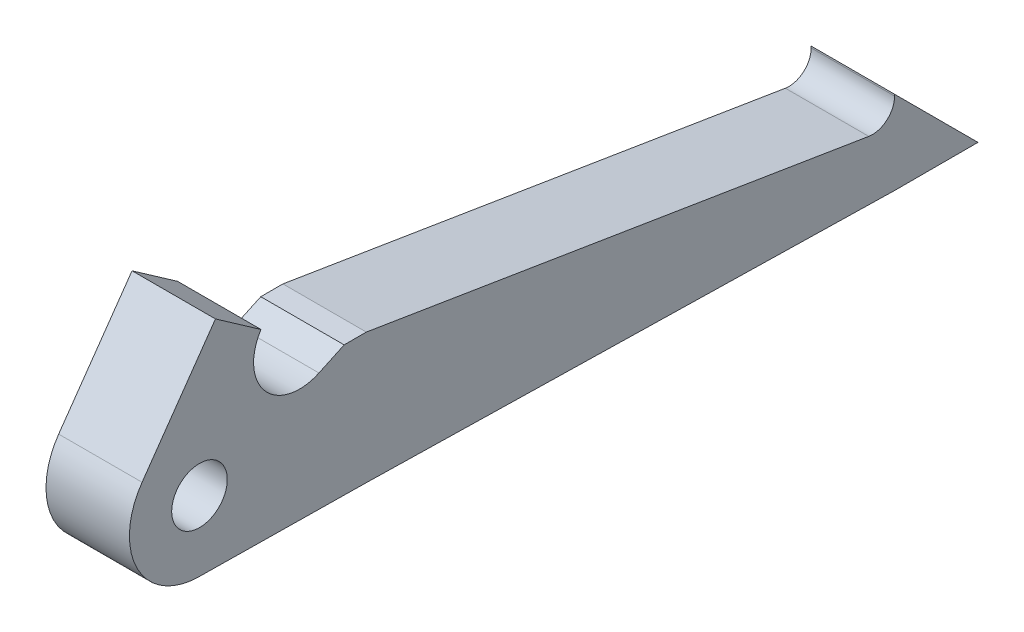
ISO-10303-21;
HEADER;
FILE_DESCRIPTION(('STEP AP214'),'2;1');
FILE_NAME('part.step','',(''),(''),'','','');
FILE_SCHEMA(('AUTOMOTIVE_DESIGN { 1 0 10303 214 1 1 1 1 }'));
ENDSEC;
DATA;
#1=APPLICATION_CONTEXT('core data for automotive mechanical design processes');
#2=APPLICATION_PROTOCOL_DEFINITION('international standard','automotive_design',2000,#1);
#3=PRODUCT_CONTEXT('',#1,'mechanical');
#4=PRODUCT('Part','Part','',(#3));
#5=PRODUCT_RELATED_PRODUCT_CATEGORY('part','',(#4));
#6=PRODUCT_DEFINITION_FORMATION('','',#4);
#7=PRODUCT_DEFINITION_CONTEXT('part definition',#1,'design');
#8=PRODUCT_DEFINITION('design','',#6,#7);
#9=PRODUCT_DEFINITION_SHAPE('','',#8);
#10=(LENGTH_UNIT() NAMED_UNIT(*) SI_UNIT(.MILLI.,.METRE.));
#11=(NAMED_UNIT(*) PLANE_ANGLE_UNIT() SI_UNIT($,.RADIAN.));
#12=(NAMED_UNIT(*) SI_UNIT($,.STERADIAN.) SOLID_ANGLE_UNIT());
#13=UNCERTAINTY_MEASURE_WITH_UNIT(LENGTH_MEASURE(1.E-05),#10,'distance_accuracy_value','');
#14=(GEOMETRIC_REPRESENTATION_CONTEXT(3) GLOBAL_UNCERTAINTY_ASSIGNED_CONTEXT((#13)) GLOBAL_UNIT_ASSIGNED_CONTEXT((#10,
#11,#12)) REPRESENTATION_CONTEXT('',''));
#15=CARTESIAN_POINT('',(0.,0.,0.));
#16=DIRECTION('',(0.,0.,1.));
#17=DIRECTION('',(1.,0.,0.));
#18=AXIS2_PLACEMENT_3D('',#15,#16,#17);
#19=CARTESIAN_POINT('',(4.7625,9.525,-176.47164647412));
#20=DIRECTION('',(1.,0.,0.));
#21=DIRECTION('',(0.,0.,-1.));
#22=AXIS2_PLACEMENT_3D('',#19,#20,#21);
#23=PLANE('',#22);
#24=CARTESIAN_POINT('',(4.7625,9.525,-176.47164647412));
#25=DIRECTION('',(1.,0.,0.));
#26=DIRECTION('',(0.,0.,-1.));
#27=AXIS2_PLACEMENT_3D('',#24,#25,#26);
#28=CIRCLE('',#27,8.00100000000001);
#29=CARTESIAN_POINT('',(4.7625,14.1141850672447,-169.917610967764));
#30=VERTEX_POINT('',#29);
#31=CARTESIAN_POINT('',(4.7625,1.52470715135464,-176.365272906379));
#32=VERTEX_POINT('',#31);
#33=EDGE_CURVE('E180',#30,#32,#28,.T.);
#34=ORIENTED_EDGE('',*,*,#33,.T.);
#35=DIRECTION('',(0.,-0.0132950340883751,-0.999911617128528));
#36=VECTOR('',#35,1.);
#37=CARTESIAN_POINT('',(4.7625,1.27000000001228,-195.521646474134));
#38=LINE('',#37,#36);
#39=CARTESIAN_POINT('',(4.7625,1.27000000001228,-195.521646474134));
#40=VERTEX_POINT('',#39);
#41=EDGE_CURVE('E157',#32,#40,#38,.T.);
#42=ORIENTED_EDGE('',*,*,#41,.T.);
#43=DIRECTION('',(0.,-0.021047967726086,-0.999778466988863));
#44=VECTOR('',#43,1.);
#45=CARTESIAN_POINT('',(4.7625,1.27000000001228,-195.521646474134));
#46=LINE('',#45,#44);
#47=CARTESIAN_POINT('',(4.7625,1.22757706777499E-11,-255.846646474121));
#48=VERTEX_POINT('',#47);
#49=EDGE_CURVE('E139',#40,#48,#46,.T.);
#50=ORIENTED_EDGE('',*,*,#49,.T.);
#51=DIRECTION('',(0.,0.,-1.));
#52=VECTOR('',#51,1.);
#53=CARTESIAN_POINT('',(4.7625,1.22757706777499E-11,-255.846646474121));
#54=LINE('',#53,#52);
#55=CARTESIAN_POINT('',(4.7625,1.22755538373154E-11,-265.37164647412));
#56=VERTEX_POINT('',#55);
#57=EDGE_CURVE('E148',#48,#56,#54,.T.);
#58=ORIENTED_EDGE('',*,*,#57,.T.);
#59=DIRECTION('',(0.,0.707106781186549,0.707106781186546));
#60=VECTOR('',#59,1.);
#61=CARTESIAN_POINT('',(4.7625,9.52500000001227,-255.846646474121));
#62=LINE('',#61,#60);
#63=CARTESIAN_POINT('',(4.7625,9.52500000001227,-255.846646474121));
#64=VERTEX_POINT('',#63);
#65=EDGE_CURVE('E153',#56,#64,#62,.T.);
#66=ORIENTED_EDGE('',*,*,#65,.T.);
#67=DIRECTION('',(0.,-1.,0.));
#68=VECTOR('',#67,1.);
#69=CARTESIAN_POINT('',(4.7625,6.35000000001228,-255.846646474121));
#70=LINE('',#69,#68);
#71=CARTESIAN_POINT('',(4.7625,9.33666420088782,-255.846646474121));
#72=VERTEX_POINT('',#71);
#73=EDGE_CURVE('E165',#64,#72,#70,.T.);
#74=ORIENTED_EDGE('',*,*,#73,.T.);
#75=CARTESIAN_POINT('',(4.7625,9.33666420088777,-253.306646474121));
#76=DIRECTION('',(1.,0.,0.));
#77=DIRECTION('',(0.,0.,-1.));
#78=AXIS2_PLACEMENT_3D('',#75,#76,#77);
#79=CIRCLE('',#78,2.54);
#80=CARTESIAN_POINT('',(4.7625,6.82963066189714,-252.898745953925));
#81=VERTEX_POINT('',#80);
#82=EDGE_CURVE('E47',#72,#81,#79,.F.);
#83=ORIENTED_EDGE('',*,*,#82,.T.);
#84=DIRECTION('',(0.,0.160590755982631,0.987021078342771));
#85=VECTOR('',#84,1.);
#86=CARTESIAN_POINT('',(4.7625,16.1650258056597,-195.52164647412));
#87=LINE('',#86,#85);
#88=CARTESIAN_POINT('',(4.7625,16.1650258056597,-195.52164647412));
#89=VERTEX_POINT('',#88);
#90=EDGE_CURVE('E145',#81,#89,#87,.T.);
#91=ORIENTED_EDGE('',*,*,#90,.T.);
#92=DIRECTION('',(0.,0.,1.));
#93=VECTOR('',#92,1.);
#94=CARTESIAN_POINT('',(4.7625,16.1650258056597,-192.993410989748));
#95=LINE('',#94,#93);
#96=CARTESIAN_POINT('',(4.7625,16.1650258056597,-192.993410989748));
#97=VERTEX_POINT('',#96);
#98=EDGE_CURVE('E184',#89,#97,#95,.T.);
#99=ORIENTED_EDGE('',*,*,#98,.T.);
#100=DIRECTION('',(0.,-0.422618261740697,0.906307787036651));
#101=VECTOR('',#100,1.);
#102=CARTESIAN_POINT('',(4.7625,14.823212824633,-190.115883765906));
#103=LINE('',#102,#101);
#104=CARTESIAN_POINT('',(4.7625,14.823212824633,-190.115883765906));
#105=VERTEX_POINT('',#104);
#106=EDGE_CURVE('E186',#97,#105,#103,.T.);
#107=ORIENTED_EDGE('',*,*,#106,.T.);
#108=CARTESIAN_POINT('',(4.7625,19.5790932010246,-187.898180325126));
#109=DIRECTION('',(-1.,0.,0.));
#110=DIRECTION('',(0.,0.,-1.));
#111=AXIS2_PLACEMENT_3D('',#108,#109,#110);
#112=CIRCLE('',#111,5.24753339253749);
#113=CARTESIAN_POINT('',(4.7625,22.4356903032563,-183.496310301906));
#114=VERTEX_POINT('',#113);
#115=EDGE_CURVE('E188',#105,#114,#112,.T.);
#116=ORIENTED_EDGE('',*,*,#115,.T.);
#117=DIRECTION('',(0.,0.573576436351047,0.819152044288991));
#118=VECTOR('',#117,1.);
#119=CARTESIAN_POINT('',(4.7625,26.0779006740854,-178.294694820671));
#120=LINE('',#119,#118);
#121=CARTESIAN_POINT('',(4.7625,26.0779006740854,-178.294694820671));
#122=VERTEX_POINT('',#121);
#123=EDGE_CURVE('E190',#114,#122,#120,.T.);
#124=ORIENTED_EDGE('',*,*,#123,.T.);
#125=DIRECTION('',(0.,-0.819152044288991,0.573576436351048));
#126=VECTOR('',#125,1.);
#127=CARTESIAN_POINT('',(4.7625,14.1141850672447,-169.917610967764));
#128=LINE('',#127,#126);
#129=EDGE_CURVE('E192',#122,#30,#128,.T.);
#130=ORIENTED_EDGE('',*,*,#129,.T.);
#131=EDGE_LOOP('',(#34,#42,#50,#58,#66,#74,#83,#91,#99,#107,#116,#124,#130));
#132=FACE_BOUND('',#131,.T.);
#133=CARTESIAN_POINT('',(4.7625,9.525,-176.47164647412));
#134=DIRECTION('',(1.,0.,0.));
#135=DIRECTION('',(0.,0.,-1.));
#136=AXIS2_PLACEMENT_3D('',#133,#134,#135);
#137=CIRCLE('',#136,3.17499999999995);
#138=CARTESIAN_POINT('',(4.7625,9.525,-173.296646474121));
#139=VERTEX_POINT('',#138);
#140=EDGE_CURVE('E174',#139,#139,#137,.T.);
#141=ORIENTED_EDGE('',*,*,#140,.F.);
#142=EDGE_LOOP('',(#141));
#143=FACE_BOUND('',#142,.T.);
#144=ADVANCED_FACE('F39',(#132,#143),#23,.T.);
#145=CARTESIAN_POINT('',(-4.7625,9.525,-176.47164647412));
#146=DIRECTION('',(1.,0.,0.));
#147=DIRECTION('',(0.,0.,-1.));
#148=AXIS2_PLACEMENT_3D('',#145,#146,#147);
#149=PLANE('',#148);
#150=CARTESIAN_POINT('',(-4.7625,9.525,-176.47164647412));
#151=DIRECTION('',(1.,0.,0.));
#152=DIRECTION('',(0.,0.,-1.));
#153=AXIS2_PLACEMENT_3D('',#150,#151,#152);
#154=CIRCLE('',#153,8.00100000000001);
#155=CARTESIAN_POINT('',(-4.7625,14.1141850672447,-169.917610967764));
#156=VERTEX_POINT('',#155);
#157=CARTESIAN_POINT('',(-4.7625,1.52470715135464,-176.365272906379));
#158=VERTEX_POINT('',#157);
#159=EDGE_CURVE('E177',#156,#158,#154,.T.);
#160=ORIENTED_EDGE('',*,*,#159,.F.);
#161=DIRECTION('',(0.,-0.819152044288991,0.573576436351048));
#162=VECTOR('',#161,1.);
#163=CARTESIAN_POINT('',(-4.7625,14.1141850672447,-169.917610967764));
#164=LINE('',#163,#162);
#165=CARTESIAN_POINT('',(-4.7625,26.0779006740854,-178.294694820671));
#166=VERTEX_POINT('',#165);
#167=EDGE_CURVE('E182',#166,#156,#164,.T.);
#168=ORIENTED_EDGE('',*,*,#167,.F.);
#169=DIRECTION('',(0.,0.573576436351047,0.819152044288991));
#170=VECTOR('',#169,1.);
#171=CARTESIAN_POINT('',(-4.7625,26.0779006740854,-178.294694820671));
#172=LINE('',#171,#170);
#173=CARTESIAN_POINT('',(-4.7625,22.4356903032563,-183.496310301906));
#174=VERTEX_POINT('',#173);
#175=EDGE_CURVE('E205',#174,#166,#172,.T.);
#176=ORIENTED_EDGE('',*,*,#175,.F.);
#177=CARTESIAN_POINT('',(-4.7625,19.5790932010246,-187.898180325126));
#178=DIRECTION('',(-1.,0.,0.));
#179=DIRECTION('',(0.,0.,-1.));
#180=AXIS2_PLACEMENT_3D('',#177,#178,#179);
#181=CIRCLE('',#180,5.24753339253749);
#182=CARTESIAN_POINT('',(-4.7625,14.823212824633,-190.115883765906));
#183=VERTEX_POINT('',#182);
#184=EDGE_CURVE('E203',#183,#174,#181,.T.);
#185=ORIENTED_EDGE('',*,*,#184,.F.);
#186=DIRECTION('',(0.,-0.422618261740697,0.906307787036651));
#187=VECTOR('',#186,1.);
#188=CARTESIAN_POINT('',(-4.7625,14.823212824633,-190.115883765906));
#189=LINE('',#188,#187);
#190=CARTESIAN_POINT('',(-4.7625,16.1650258056597,-192.993410989748));
#191=VERTEX_POINT('',#190);
#192=EDGE_CURVE('E201',#191,#183,#189,.T.);
#193=ORIENTED_EDGE('',*,*,#192,.F.);
#194=DIRECTION('',(0.,0.,1.));
#195=VECTOR('',#194,1.);
#196=CARTESIAN_POINT('',(-4.7625,16.1650258056597,-192.993410989748));
#197=LINE('',#196,#195);
#198=CARTESIAN_POINT('',(-4.7625,16.1650258056597,-195.52164647412));
#199=VERTEX_POINT('',#198);
#200=EDGE_CURVE('E199',#199,#191,#197,.T.);
#201=ORIENTED_EDGE('',*,*,#200,.F.);
#202=DIRECTION('',(0.,-0.160590755982631,-0.987021078342771));
#203=VECTOR('',#202,1.);
#204=CARTESIAN_POINT('',(-4.7625,16.1650258056597,-195.52164647412));
#205=LINE('',#204,#203);
#206=CARTESIAN_POINT('',(-4.7625,6.82963066189714,-252.898745953925));
#207=VERTEX_POINT('',#206);
#208=EDGE_CURVE('E161',#199,#207,#205,.T.);
#209=ORIENTED_EDGE('',*,*,#208,.T.);
#210=CARTESIAN_POINT('',(-4.7625,9.33666420088777,-253.306646474121));
#211=DIRECTION('',(1.,0.,0.));
#212=DIRECTION('',(0.,0.,-1.));
#213=AXIS2_PLACEMENT_3D('',#210,#211,#212);
#214=CIRCLE('',#213,2.54);
#215=CARTESIAN_POINT('',(-4.7625,9.33666420088782,-255.846646474121));
#216=VERTEX_POINT('',#215);
#217=EDGE_CURVE('E11',#207,#216,#214,.T.);
#218=ORIENTED_EDGE('',*,*,#217,.T.);
#219=DIRECTION('',(0.,1.,0.));
#220=VECTOR('',#219,1.);
#221=CARTESIAN_POINT('',(-4.7625,6.35000000001228,-255.846646474121));
#222=LINE('',#221,#220);
#223=CARTESIAN_POINT('',(-4.7625,9.52500000001225,-255.846646474121));
#224=VERTEX_POINT('',#223);
#225=EDGE_CURVE('E238',#216,#224,#222,.T.);
#226=ORIENTED_EDGE('',*,*,#225,.T.);
#227=DIRECTION('',(0.,-0.707106781186549,-0.707106781186546));
#228=VECTOR('',#227,1.);
#229=CARTESIAN_POINT('',(-4.7625,9.52500000001227,-255.846646474121));
#230=LINE('',#229,#228);
#231=CARTESIAN_POINT('',(-4.7625,1.22755538373154E-11,-265.37164647412));
#232=VERTEX_POINT('',#231);
#233=EDGE_CURVE('E244',#224,#232,#230,.T.);
#234=ORIENTED_EDGE('',*,*,#233,.T.);
#235=DIRECTION('',(0.,0.,1.));
#236=VECTOR('',#235,1.);
#237=CARTESIAN_POINT('',(-4.7625,1.22757706777499E-11,-255.846646474121));
#238=LINE('',#237,#236);
#239=CARTESIAN_POINT('',(-4.7625,1.22757706777499E-11,-255.846646474121));
#240=VERTEX_POINT('',#239);
#241=EDGE_CURVE('E170',#232,#240,#238,.T.);
#242=ORIENTED_EDGE('',*,*,#241,.T.);
#243=DIRECTION('',(0.,0.021047967726086,0.999778466988863));
#244=VECTOR('',#243,1.);
#245=CARTESIAN_POINT('',(-4.7625,1.27000000001228,-195.521646474134));
#246=LINE('',#245,#244);
#247=CARTESIAN_POINT('',(-4.7625,1.27000000001228,-195.521646474134));
#248=VERTEX_POINT('',#247);
#249=EDGE_CURVE('E141',#240,#248,#246,.T.);
#250=ORIENTED_EDGE('',*,*,#249,.T.);
#251=DIRECTION('',(0.,-0.0132950340883751,-0.999911617128528));
#252=VECTOR('',#251,1.);
#253=CARTESIAN_POINT('',(-4.7625,1.27000000001228,-195.521646474134));
#254=LINE('',#253,#252);
#255=EDGE_CURVE('E197',#158,#248,#254,.T.);
#256=ORIENTED_EDGE('',*,*,#255,.F.);
#257=EDGE_LOOP('',(#160,#168,#176,#185,#193,#201,#209,#218,#226,#234,#242,#250,#256));
#258=FACE_BOUND('',#257,.T.);
#259=CARTESIAN_POINT('',(-4.7625,9.525,-176.47164647412));
#260=DIRECTION('',(1.,0.,0.));
#261=DIRECTION('',(0.,0.,-1.));
#262=AXIS2_PLACEMENT_3D('',#259,#260,#261);
#263=CIRCLE('',#262,3.17499999999995);
#264=CARTESIAN_POINT('',(-4.7625,9.525,-173.296646474121));
#265=VERTEX_POINT('',#264);
#266=EDGE_CURVE('E173',#265,#265,#263,.T.);
#267=ORIENTED_EDGE('',*,*,#266,.T.);
#268=EDGE_LOOP('',(#267));
#269=FACE_BOUND('',#268,.T.);
#270=ADVANCED_FACE('F249',(#258,#269),#149,.F.);
#271=CARTESIAN_POINT('',(4.7625,9.525,-176.47164647412));
#272=DIRECTION('',(-1.,0.,0.));
#273=DIRECTION('',(0.,0.,1.));
#274=AXIS2_PLACEMENT_3D('',#271,#272,#273);
#275=CYLINDRICAL_SURFACE('',#274,8.00100000000001);
#276=ORIENTED_EDGE('',*,*,#159,.T.);
#277=DIRECTION('',(-1.,0.,0.));
#278=VECTOR('',#277,1.);
#279=CARTESIAN_POINT('',(4.7625,1.52470715135464,-176.365272906379));
#280=LINE('',#279,#278);
#281=EDGE_CURVE('E226',#32,#158,#280,.T.);
#282=ORIENTED_EDGE('',*,*,#281,.F.);
#283=ORIENTED_EDGE('',*,*,#33,.F.);
#284=DIRECTION('',(-1.,0.,0.));
#285=VECTOR('',#284,1.);
#286=CARTESIAN_POINT('',(4.7625,14.1141850672447,-169.917610967764));
#287=LINE('',#286,#285);
#288=EDGE_CURVE('E194',#30,#156,#287,.T.);
#289=ORIENTED_EDGE('',*,*,#288,.T.);
#290=EDGE_LOOP('',(#276,#282,#283,#289));
#291=FACE_BOUND('',#290,.T.);
#292=ADVANCED_FACE('F256',(#291),#275,.T.);
#293=CARTESIAN_POINT('',(4.7625,1.27000000001228,-195.521646474134));
#294=DIRECTION('',(0.,0.999911617128528,-0.0132950340883751));
#295=DIRECTION('',(0.,0.0132950340883751,0.999911617128529));
#296=AXIS2_PLACEMENT_3D('',#293,#294,#295);
#297=PLANE('',#296);
#298=ORIENTED_EDGE('',*,*,#255,.T.);
#299=DIRECTION('',(-1.,0.,0.));
#300=VECTOR('',#299,1.);
#301=CARTESIAN_POINT('',(4.7625,1.27000000001228,-195.521646474134));
#302=LINE('',#301,#300);
#303=EDGE_CURVE('E224',#40,#248,#302,.T.);
#304=ORIENTED_EDGE('',*,*,#303,.F.);
#305=ORIENTED_EDGE('',*,*,#41,.F.);
#306=ORIENTED_EDGE('',*,*,#281,.T.);
#307=EDGE_LOOP('',(#298,#304,#305,#306));
#308=FACE_BOUND('',#307,.T.);
#309=ADVANCED_FACE('F252',(#308),#297,.F.);
#310=CARTESIAN_POINT('',(4.7625,16.1650258056597,-192.993410989748));
#311=DIRECTION('',(0.,-1.,0.));
#312=DIRECTION('',(0.,0.,-1.));
#313=AXIS2_PLACEMENT_3D('',#310,#311,#312);
#314=PLANE('',#313);
#315=ORIENTED_EDGE('',*,*,#200,.T.);
#316=DIRECTION('',(-1.,0.,0.));
#317=VECTOR('',#316,1.);
#318=CARTESIAN_POINT('',(4.7625,16.1650258056597,-192.993410989748));
#319=LINE('',#318,#317);
#320=EDGE_CURVE('E219',#97,#191,#319,.T.);
#321=ORIENTED_EDGE('',*,*,#320,.F.);
#322=ORIENTED_EDGE('',*,*,#98,.F.);
#323=DIRECTION('',(-1.,0.,0.));
#324=VECTOR('',#323,1.);
#325=CARTESIAN_POINT('',(4.7625,16.1650258056597,-195.52164647412));
#326=LINE('',#325,#324);
#327=EDGE_CURVE('E222',#89,#199,#326,.T.);
#328=ORIENTED_EDGE('',*,*,#327,.T.);
#329=EDGE_LOOP('',(#315,#321,#322,#328));
#330=FACE_BOUND('',#329,.T.);
#331=ADVANCED_FACE('F281',(#330),#314,.F.);
#332=CARTESIAN_POINT('',(4.7625,14.823212824633,-190.115883765906));
#333=DIRECTION('',(0.,-0.906307787036651,-0.422618261740697));
#334=DIRECTION('',(0.,0.422618261740697,-0.906307787036651));
#335=AXIS2_PLACEMENT_3D('',#332,#333,#334);
#336=PLANE('',#335);
#337=ORIENTED_EDGE('',*,*,#192,.T.);
#338=DIRECTION('',(-1.,0.,0.));
#339=VECTOR('',#338,1.);
#340=CARTESIAN_POINT('',(4.7625,14.823212824633,-190.115883765906));
#341=LINE('',#340,#339);
#342=EDGE_CURVE('E216',#105,#183,#341,.T.);
#343=ORIENTED_EDGE('',*,*,#342,.F.);
#344=ORIENTED_EDGE('',*,*,#106,.F.);
#345=ORIENTED_EDGE('',*,*,#320,.T.);
#346=EDGE_LOOP('',(#337,#343,#344,#345));
#347=FACE_BOUND('',#346,.T.);
#348=ADVANCED_FACE('F276',(#347),#336,.F.);
#349=CARTESIAN_POINT('',(4.7625,19.5790932010246,-187.898180325126));
#350=DIRECTION('',(-1.,0.,0.));
#351=DIRECTION('',(0.,0.,1.));
#352=AXIS2_PLACEMENT_3D('',#349,#350,#351);
#353=CYLINDRICAL_SURFACE('',#352,5.24753339253749);
#354=ORIENTED_EDGE('',*,*,#184,.T.);
#355=DIRECTION('',(-1.,0.,0.));
#356=VECTOR('',#355,1.);
#357=CARTESIAN_POINT('',(4.7625,22.4356903032563,-183.496310301906));
#358=LINE('',#357,#356);
#359=EDGE_CURVE('E213',#114,#174,#358,.T.);
#360=ORIENTED_EDGE('',*,*,#359,.F.);
#361=ORIENTED_EDGE('',*,*,#115,.F.);
#362=ORIENTED_EDGE('',*,*,#342,.T.);
#363=EDGE_LOOP('',(#354,#360,#361,#362));
#364=FACE_BOUND('',#363,.T.);
#365=ADVANCED_FACE('F271',(#364),#353,.F.);
#366=CARTESIAN_POINT('',(4.7625,26.0779006740854,-178.294694820671));
#367=DIRECTION('',(0.,-0.819152044288991,0.573576436351047));
#368=DIRECTION('',(0.,-0.573576436351047,-0.819152044288991));
#369=AXIS2_PLACEMENT_3D('',#366,#367,#368);
#370=PLANE('',#369);
#371=ORIENTED_EDGE('',*,*,#175,.T.);
#372=DIRECTION('',(-1.,0.,0.));
#373=VECTOR('',#372,1.);
#374=CARTESIAN_POINT('',(4.7625,26.0779006740854,-178.294694820671));
#375=LINE('',#374,#373);
#376=EDGE_CURVE('E210',#122,#166,#375,.T.);
#377=ORIENTED_EDGE('',*,*,#376,.F.);
#378=ORIENTED_EDGE('',*,*,#123,.F.);
#379=ORIENTED_EDGE('',*,*,#359,.T.);
#380=EDGE_LOOP('',(#371,#377,#378,#379));
#381=FACE_BOUND('',#380,.T.);
#382=ADVANCED_FACE('F267',(#381),#370,.F.);
#383=CARTESIAN_POINT('',(4.7625,14.1141850672447,-169.917610967764));
#384=DIRECTION('',(0.,-0.573576436351048,-0.81915204428899));
#385=DIRECTION('',(0.,0.819152044288991,-0.573576436351048));
#386=AXIS2_PLACEMENT_3D('',#383,#384,#385);
#387=PLANE('',#386);
#388=ORIENTED_EDGE('',*,*,#167,.T.);
#389=ORIENTED_EDGE('',*,*,#288,.F.);
#390=ORIENTED_EDGE('',*,*,#129,.F.);
#391=ORIENTED_EDGE('',*,*,#376,.T.);
#392=EDGE_LOOP('',(#388,#389,#390,#391));
#393=FACE_BOUND('',#392,.T.);
#394=ADVANCED_FACE('F262',(#393),#387,.F.);
#395=CARTESIAN_POINT('',(4.7625,9.525,-176.47164647412));
#396=DIRECTION('',(-1.,0.,0.));
#397=DIRECTION('',(0.,0.,1.));
#398=AXIS2_PLACEMENT_3D('',#395,#396,#397);
#399=CYLINDRICAL_SURFACE('',#398,3.17499999999995);
#400=CARTESIAN_POINT('',(4.7625,9.525,-173.296646474121));
#401=CARTESIAN_POINT('',(4.66328125,9.525,-173.296646474121));
#402=CARTESIAN_POINT('',(4.5640625,9.525,-173.296646474121));
#403=CARTESIAN_POINT('',(4.365625,9.525,-173.296646474121));
#404=CARTESIAN_POINT('',(4.26640625,9.525,-173.296646474121));
#405=CARTESIAN_POINT('',(4.06796875,9.525,-173.296646474121));
#406=CARTESIAN_POINT('',(3.96875,9.525,-173.296646474121));
#407=CARTESIAN_POINT('',(3.7703125,9.525,-173.296646474121));
#408=CARTESIAN_POINT('',(3.67109375,9.525,-173.296646474121));
#409=CARTESIAN_POINT('',(3.47265625,9.525,-173.296646474121));
#410=CARTESIAN_POINT('',(3.3734375,9.525,-173.296646474121));
#411=CARTESIAN_POINT('',(3.175,9.525,-173.296646474121));
#412=CARTESIAN_POINT('',(3.07578125,9.525,-173.296646474121));
#413=CARTESIAN_POINT('',(2.87734375,9.525,-173.296646474121));
#414=CARTESIAN_POINT('',(2.778125,9.525,-173.296646474121));
#415=CARTESIAN_POINT('',(2.5796875,9.525,-173.296646474121));
#416=CARTESIAN_POINT('',(2.48046875,9.525,-173.296646474121));
#417=CARTESIAN_POINT('',(2.28203125,9.525,-173.296646474121));
#418=CARTESIAN_POINT('',(2.1828125,9.525,-173.296646474121));
#419=CARTESIAN_POINT('',(1.984375,9.525,-173.296646474121));
#420=CARTESIAN_POINT('',(1.88515625,9.525,-173.296646474121));
#421=CARTESIAN_POINT('',(1.68671875,9.525,-173.296646474121));
#422=CARTESIAN_POINT('',(1.5875,9.525,-173.296646474121));
#423=CARTESIAN_POINT('',(1.3890625,9.525,-173.296646474121));
#424=CARTESIAN_POINT('',(1.28984375,9.525,-173.296646474121));
#425=CARTESIAN_POINT('',(1.09140625,9.525,-173.296646474121));
#426=CARTESIAN_POINT('',(0.992187499999999,9.525,-173.296646474121));
#427=CARTESIAN_POINT('',(0.79375,9.525,-173.296646474121));
#428=CARTESIAN_POINT('',(0.69453125,9.525,-173.296646474121));
#429=CARTESIAN_POINT('',(0.49609375,9.525,-173.296646474121));
#430=CARTESIAN_POINT('',(0.396875,9.525,-173.296646474121));
#431=CARTESIAN_POINT('',(0.1984375,9.525,-173.296646474121));
#432=CARTESIAN_POINT('',(0.0992187500000001,9.525,-173.296646474121));
#433=CARTESIAN_POINT('',(-0.0992187500000001,9.525,-173.296646474121));
#434=CARTESIAN_POINT('',(-0.1984375,9.525,-173.296646474121));
#435=CARTESIAN_POINT('',(-0.396875,9.525,-173.296646474121));
#436=CARTESIAN_POINT('',(-0.49609375,9.525,-173.296646474121));
#437=CARTESIAN_POINT('',(-0.69453125,9.525,-173.296646474121));
#438=CARTESIAN_POINT('',(-0.793750000000001,9.525,-173.296646474121));
#439=CARTESIAN_POINT('',(-0.992187500000001,9.525,-173.296646474121));
#440=CARTESIAN_POINT('',(-1.09140625,9.525,-173.296646474121));
#441=CARTESIAN_POINT('',(-1.28984375,9.525,-173.296646474121));
#442=CARTESIAN_POINT('',(-1.3890625,9.525,-173.296646474121));
#443=CARTESIAN_POINT('',(-1.5875,9.525,-173.296646474121));
#444=CARTESIAN_POINT('',(-1.68671875,9.525,-173.296646474121));
#445=CARTESIAN_POINT('',(-1.88515625,9.525,-173.296646474121));
#446=CARTESIAN_POINT('',(-1.984375,9.525,-173.296646474121));
#447=CARTESIAN_POINT('',(-2.1828125,9.525,-173.296646474121));
#448=CARTESIAN_POINT('',(-2.28203125,9.525,-173.296646474121));
#449=CARTESIAN_POINT('',(-2.48046875,9.525,-173.296646474121));
#450=CARTESIAN_POINT('',(-2.5796875,9.525,-173.296646474121));
#451=CARTESIAN_POINT('',(-2.778125,9.525,-173.296646474121));
#452=CARTESIAN_POINT('',(-2.87734375,9.525,-173.296646474121));
#453=CARTESIAN_POINT('',(-3.07578125,9.525,-173.296646474121));
#454=CARTESIAN_POINT('',(-3.175,9.525,-173.296646474121));
#455=CARTESIAN_POINT('',(-3.3734375,9.525,-173.296646474121));
#456=CARTESIAN_POINT('',(-3.47265625,9.525,-173.296646474121));
#457=CARTESIAN_POINT('',(-3.67109375,9.525,-173.296646474121));
#458=CARTESIAN_POINT('',(-3.7703125,9.525,-173.296646474121));
#459=CARTESIAN_POINT('',(-3.96875,9.525,-173.296646474121));
#460=CARTESIAN_POINT('',(-4.06796875,9.525,-173.296646474121));
#461=CARTESIAN_POINT('',(-4.26640625,9.525,-173.296646474121));
#462=CARTESIAN_POINT('',(-4.365625,9.525,-173.296646474121));
#463=CARTESIAN_POINT('',(-4.5640625,9.525,-173.296646474121));
#464=CARTESIAN_POINT('',(-4.66328125,9.525,-173.296646474121));
#465=CARTESIAN_POINT('',(-4.7625,9.525,-173.296646474121));
#466=B_SPLINE_CURVE_WITH_KNOTS('',3,(#400,#401,#402,#403,#404,#405,#406,#407,#408,#409,#410,
#411,#412,#413,#414,#415,#416,#417,#418,#419,#420,#421,#422,#423,#424,#425,#426,#427,#428,#429,
#430,#431,#432,#433,#434,#435,#436,#437,#438,#439,#440,#441,#442,#443,#444,#445,#446,#447,#448,
#449,#450,#451,#452,#453,#454,#455,#456,#457,#458,#459,#460,#461,#462,#463,#464,#465),
.UNSPECIFIED.,.F.,.F.,(4,2,2,2,2,2,2,2,2,2,2,2,2,2,2,2,2,2,2,2,2,2,2,2,2,2,2,2,2,2,2,2,4),(0.,
0.29765625,0.5953125,0.892968750000001,1.190625,1.48828125,1.7859375,2.08359375,2.38125,
2.67890625,2.9765625,3.27421875,3.571875,3.86953125,4.1671875,4.46484375,4.7625,5.06015625,
5.3578125,5.65546875,5.953125,6.25078125,6.5484375,6.84609375,7.14375,7.44140625,7.7390625,
8.03671875,8.334375,8.63203125,8.9296875,9.22734375,9.525),.UNSPECIFIED.);
#467=EDGE_CURVE('BSEAM296',#139,#265,#466,.T.);
#468=ORIENTED_EDGE('',*,*,#140,.T.);
#469=ORIENTED_EDGE('',*,*,#266,.F.);
#470=ORIENTED_EDGE('',*,*,#467,.T.);
#471=ORIENTED_EDGE('',*,*,#467,.F.);
#472=EDGE_LOOP('',(#468,#470,#469,#471));
#473=FACE_BOUND('',#472,.T.);
#474=ADVANCED_FACE('F296',(#473),#399,.F.);
#475=CARTESIAN_POINT('',(-76.458598633728,16.1650258056597,-195.52164647412));
#476=DIRECTION('',(0.,0.987021078342771,-0.160590755982631));
#477=DIRECTION('',(0.,0.160590755982631,0.987021078342771));
#478=AXIS2_PLACEMENT_3D('',#475,#476,#477);
#479=PLANE('',#478);
#480=ORIENTED_EDGE('',*,*,#90,.F.);
#481=DIRECTION('',(1.,0.,0.));
#482=VECTOR('',#481,1.);
#483=CARTESIAN_POINT('',(-4.76250000000003,6.82963066189714,-252.898745953925));
#484=LINE('',#483,#482);
#485=EDGE_CURVE('E60',#81,#207,#484,.F.);
#486=ORIENTED_EDGE('',*,*,#485,.T.);
#487=ORIENTED_EDGE('',*,*,#208,.F.);
#488=ORIENTED_EDGE('',*,*,#327,.F.);
#489=EDGE_LOOP('',(#480,#486,#487,#488));
#490=FACE_BOUND('',#489,.T.);
#491=ADVANCED_FACE('F283',(#490),#479,.T.);
#492=CARTESIAN_POINT('',(-76.458598633728,6.35000000001228,-255.846646474121));
#493=DIRECTION('',(0.,0.,1.));
#494=DIRECTION('',(0.,-1.,0.));
#495=AXIS2_PLACEMENT_3D('',#492,#493,#494);
#496=PLANE('',#495);
#497=ORIENTED_EDGE('',*,*,#225,.F.);
#498=DIRECTION('',(1.,0.,0.));
#499=VECTOR('',#498,1.);
#500=CARTESIAN_POINT('',(4.76249999999998,9.33666420088782,-255.846646474121));
#501=LINE('',#500,#499);
#502=EDGE_CURVE('E229',#216,#72,#501,.T.);
#503=ORIENTED_EDGE('',*,*,#502,.T.);
#504=ORIENTED_EDGE('',*,*,#73,.F.);
#505=DIRECTION('',(1.,0.,0.));
#506=VECTOR('',#505,1.);
#507=CARTESIAN_POINT('',(-76.458598633728,9.52500000001227,-255.846646474121));
#508=LINE('',#507,#506);
#509=EDGE_CURVE('E168',#224,#64,#508,.T.);
#510=ORIENTED_EDGE('',*,*,#509,.F.);
#511=EDGE_LOOP('',(#497,#503,#504,#510));
#512=FACE_BOUND('',#511,.T.);
#513=ADVANCED_FACE('F236',(#512),#496,.T.);
#514=CARTESIAN_POINT('',(-76.458598633728,9.52500000001227,-255.846646474121));
#515=DIRECTION('',(0.,0.707106781186546,-0.707106781186549));
#516=DIRECTION('',(0.,0.707106781186549,0.707106781186546));
#517=AXIS2_PLACEMENT_3D('',#514,#515,#516);
#518=PLANE('',#517);
#519=ORIENTED_EDGE('',*,*,#233,.F.);
#520=ORIENTED_EDGE('',*,*,#509,.T.);
#521=ORIENTED_EDGE('',*,*,#65,.F.);
#522=DIRECTION('',(1.,0.,0.));
#523=VECTOR('',#522,1.);
#524=CARTESIAN_POINT('',(-76.458598633728,1.22755538373154E-11,-265.37164647412));
#525=LINE('',#524,#523);
#526=EDGE_CURVE('E144',#232,#56,#525,.T.);
#527=ORIENTED_EDGE('',*,*,#526,.F.);
#528=EDGE_LOOP('',(#519,#520,#521,#527));
#529=FACE_BOUND('',#528,.T.);
#530=ADVANCED_FACE('F243',(#529),#518,.T.);
#531=CARTESIAN_POINT('',(-76.458598633728,1.22757706777499E-11,-255.846646474121));
#532=DIRECTION('',(0.,-1.,0.));
#533=DIRECTION('',(0.,0.,-1.));
#534=AXIS2_PLACEMENT_3D('',#531,#532,#533);
#535=PLANE('',#534);
#536=ORIENTED_EDGE('',*,*,#241,.F.);
#537=ORIENTED_EDGE('',*,*,#526,.T.);
#538=ORIENTED_EDGE('',*,*,#57,.F.);
#539=DIRECTION('',(1.,0.,0.));
#540=VECTOR('',#539,1.);
#541=CARTESIAN_POINT('',(-76.458598633728,1.22757706777499E-11,-255.846646474121));
#542=LINE('',#541,#540);
#543=EDGE_CURVE('E134',#240,#48,#542,.T.);
#544=ORIENTED_EDGE('',*,*,#543,.F.);
#545=EDGE_LOOP('',(#536,#537,#538,#544));
#546=FACE_BOUND('',#545,.T.);
#547=ADVANCED_FACE('F149',(#546),#535,.T.);
#548=CARTESIAN_POINT('',(-76.458598633728,1.27000000001228,-195.521646474134));
#549=DIRECTION('',(0.,-0.999778466988863,0.021047967726086));
#550=DIRECTION('',(0.,-0.021047967726086,-0.999778466988863));
#551=AXIS2_PLACEMENT_3D('',#548,#549,#550);
#552=PLANE('',#551);
#553=ORIENTED_EDGE('',*,*,#249,.F.);
#554=ORIENTED_EDGE('',*,*,#543,.T.);
#555=ORIENTED_EDGE('',*,*,#49,.F.);
#556=ORIENTED_EDGE('',*,*,#303,.T.);
#557=EDGE_LOOP('',(#553,#554,#555,#556));
#558=FACE_BOUND('',#557,.T.);
#559=ADVANCED_FACE('F136',(#558),#552,.T.);
#560=CARTESIAN_POINT('',(-76.458598633728,9.33666420088777,-253.306646474121));
#561=DIRECTION('',(-1.,0.,0.));
#562=DIRECTION('',(0.,0.,1.));
#563=AXIS2_PLACEMENT_3D('',#560,#561,#562);
#564=CYLINDRICAL_SURFACE('',#563,2.54);
#565=ORIENTED_EDGE('',*,*,#217,.F.);
#566=ORIENTED_EDGE('',*,*,#485,.F.);
#567=ORIENTED_EDGE('',*,*,#82,.F.);
#568=ORIENTED_EDGE('',*,*,#502,.F.);
#569=EDGE_LOOP('',(#565,#566,#567,#568));
#570=FACE_BOUND('',#569,.T.);
#571=ADVANCED_FACE('F41',(#570),#564,.F.);
#572=CLOSED_SHELL('',(#144,#270,#292,#309,#331,#348,#365,#382,#394,#474,#491,#513,#530,#547,
#559,#571));
#573=MANIFOLD_SOLID_BREP('B2',#572);
#574=ADVANCED_BREP_SHAPE_REPRESENTATION('',(#18,#573),#14);
#575=SHAPE_DEFINITION_REPRESENTATION(#9,#574);
ENDSEC;
END-ISO-10303-21;
